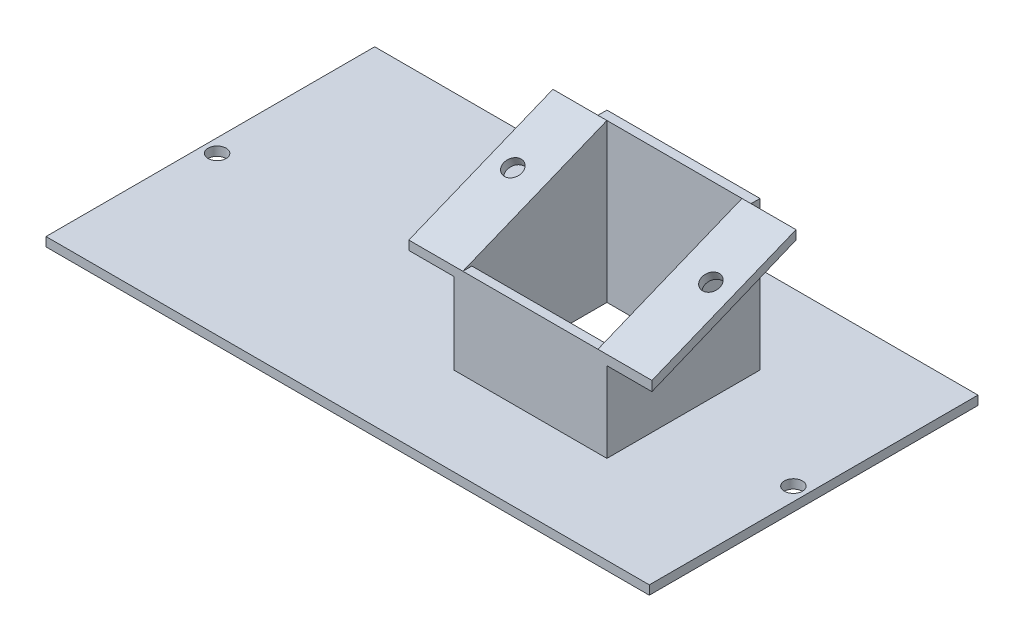
ISO-10303-21;
HEADER;
FILE_DESCRIPTION(('STEP AP214'),'2;1');
FILE_NAME('part.step','',(''),(''),'','','');
FILE_SCHEMA(('AUTOMOTIVE_DESIGN { 1 0 10303 214 1 1 1 1 }'));
ENDSEC;
DATA;
#1=APPLICATION_CONTEXT('core data for automotive mechanical design processes');
#2=APPLICATION_PROTOCOL_DEFINITION('international standard','automotive_design',2000,#1);
#3=PRODUCT_CONTEXT('',#1,'mechanical');
#4=PRODUCT('Part','Part','',(#3));
#5=PRODUCT_RELATED_PRODUCT_CATEGORY('part','',(#4));
#6=PRODUCT_DEFINITION_FORMATION('','',#4);
#7=PRODUCT_DEFINITION_CONTEXT('part definition',#1,'design');
#8=PRODUCT_DEFINITION('design','',#6,#7);
#9=PRODUCT_DEFINITION_SHAPE('','',#8);
#10=(LENGTH_UNIT() NAMED_UNIT(*) SI_UNIT(.MILLI.,.METRE.));
#11=(NAMED_UNIT(*) PLANE_ANGLE_UNIT() SI_UNIT($,.RADIAN.));
#12=(NAMED_UNIT(*) SI_UNIT($,.STERADIAN.) SOLID_ANGLE_UNIT());
#13=UNCERTAINTY_MEASURE_WITH_UNIT(LENGTH_MEASURE(1.E-05),#10,'distance_accuracy_value','');
#14=(GEOMETRIC_REPRESENTATION_CONTEXT(3) GLOBAL_UNCERTAINTY_ASSIGNED_CONTEXT((#13)) GLOBAL_UNIT_ASSIGNED_CONTEXT((#10,
#11,#12)) REPRESENTATION_CONTEXT('',''));
#15=CARTESIAN_POINT('',(0.,0.,0.));
#16=DIRECTION('',(0.,0.,1.));
#17=DIRECTION('',(1.,0.,0.));
#18=AXIS2_PLACEMENT_3D('',#15,#16,#17);
#19=CARTESIAN_POINT('',(28.7994604633108,22.,-22.5608347346221));
#20=DIRECTION('',(-1.,0.,0.));
#21=DIRECTION('',(0.,0.,1.));
#22=AXIS2_PLACEMENT_3D('',#19,#20,#21);
#23=PLANE('',#22);
#24=DIRECTION('',(0.,0.380378526899359,-0.92483089063562));
#25=VECTOR('',#24,1.);
#26=CARTESIAN_POINT('',(28.7994604633108,32.9978821570871,-20.5608347346221));
#27=LINE('',#26,#25);
#28=CARTESIAN_POINT('',(28.7994604633108,19.8364350384535,11.4391652653779));
#29=VERTEX_POINT('',#28);
#30=CARTESIAN_POINT('',(28.7994604633108,32.9978821570871,-20.5608347346221));
#31=VERTEX_POINT('',#30);
#32=EDGE_CURVE('E61',#29,#31,#27,.T.);
#33=ORIENTED_EDGE('',*,*,#32,.F.);
#34=DIRECTION('',(0.,-1.,0.));
#35=VECTOR('',#34,1.);
#36=CARTESIAN_POINT('',(28.7994604633108,22.,11.4391652653779));
#37=LINE('',#36,#35);
#38=CARTESIAN_POINT('',(28.7994604633108,2.,11.4391652653779));
#39=VERTEX_POINT('',#38);
#40=EDGE_CURVE('E194',#29,#39,#37,.T.);
#41=ORIENTED_EDGE('',*,*,#40,.T.);
#42=DIRECTION('',(0.,0.,-1.));
#43=VECTOR('',#42,1.);
#44=CARTESIAN_POINT('',(28.7994604633108,2.,-22.5608347346221));
#45=LINE('',#44,#43);
#46=CARTESIAN_POINT('',(28.7994604633108,2.,-22.5608347346221));
#47=VERTEX_POINT('',#46);
#48=EDGE_CURVE('E255',#39,#47,#45,.T.);
#49=ORIENTED_EDGE('',*,*,#48,.T.);
#50=DIRECTION('',(0.,-1.,0.));
#51=VECTOR('',#50,1.);
#52=CARTESIAN_POINT('',(28.7994604633108,22.,-22.5608347346221));
#53=LINE('',#52,#51);
#54=CARTESIAN_POINT('',(28.7994604633108,35.,-22.5608347346221));
#55=VERTEX_POINT('',#54);
#56=EDGE_CURVE('E274',#55,#47,#53,.T.);
#57=ORIENTED_EDGE('',*,*,#56,.F.);
#58=DIRECTION('',(0.,0.,-1.));
#59=VECTOR('',#58,1.);
#60=CARTESIAN_POINT('',(28.7994604633108,35.,-22.5608347346221));
#61=LINE('',#60,#59);
#62=CARTESIAN_POINT('',(28.7994604633108,35.,-20.5608347346221));
#63=VERTEX_POINT('',#62);
#64=EDGE_CURVE('E246',#63,#55,#61,.T.);
#65=ORIENTED_EDGE('',*,*,#64,.F.);
#66=DIRECTION('',(0.,1.,0.));
#67=VECTOR('',#66,1.);
#68=CARTESIAN_POINT('',(28.7994604633108,35.,-20.5608347346221));
#69=LINE('',#68,#67);
#70=EDGE_CURVE('E57',#31,#63,#69,.T.);
#71=ORIENTED_EDGE('',*,*,#70,.F.);
#72=EDGE_LOOP('',(#33,#41,#49,#57,#65,#71));
#73=FACE_BOUND('',#72,.T.);
#74=ADVANCED_FACE('F40',(#73),#23,.F.);
#75=CARTESIAN_POINT('',(-5.20053953668923,22.,-22.5608347346221));
#76=DIRECTION('',(1.,0.,0.));
#77=DIRECTION('',(0.,0.,-1.));
#78=AXIS2_PLACEMENT_3D('',#75,#76,#77);
#79=PLANE('',#78);
#80=DIRECTION('',(0.,-1.,0.));
#81=VECTOR('',#80,1.);
#82=CARTESIAN_POINT('',(-5.20053953668923,35.,-20.5608347346221));
#83=LINE('',#82,#81);
#84=CARTESIAN_POINT('',(-5.20053953668923,35.,-20.5608347346221));
#85=VERTEX_POINT('',#84);
#86=CARTESIAN_POINT('',(-5.20053953668923,32.9893160206082,-20.5608347346221));
#87=VERTEX_POINT('',#86);
#88=EDGE_CURVE('E195',#85,#87,#83,.T.);
#89=ORIENTED_EDGE('',*,*,#88,.F.);
#90=DIRECTION('',(0.,0.,1.));
#91=VECTOR('',#90,1.);
#92=CARTESIAN_POINT('',(-5.20053953668923,35.,-22.5608347346221));
#93=LINE('',#92,#91);
#94=CARTESIAN_POINT('',(-5.20053953668923,35.,-22.5608347346221));
#95=VERTEX_POINT('',#94);
#96=EDGE_CURVE('E239',#95,#85,#93,.T.);
#97=ORIENTED_EDGE('',*,*,#96,.F.);
#98=DIRECTION('',(0.,-1.,0.));
#99=VECTOR('',#98,1.);
#100=CARTESIAN_POINT('',(-5.20053953668923,22.,-22.5608347346221));
#101=LINE('',#100,#99);
#102=CARTESIAN_POINT('',(-5.20053953668923,2.,-22.5608347346221));
#103=VERTEX_POINT('',#102);
#104=EDGE_CURVE('E271',#95,#103,#101,.T.);
#105=ORIENTED_EDGE('',*,*,#104,.T.);
#106=DIRECTION('',(0.,0.,1.));
#107=VECTOR('',#106,1.);
#108=CARTESIAN_POINT('',(-5.20053953668923,2.,-22.5608347346221));
#109=LINE('',#108,#107);
#110=CARTESIAN_POINT('',(-5.20053953668922,2.,11.4391652653779));
#111=VERTEX_POINT('',#110);
#112=EDGE_CURVE('E263',#103,#111,#109,.T.);
#113=ORIENTED_EDGE('',*,*,#112,.T.);
#114=DIRECTION('',(0.,-1.,0.));
#115=VECTOR('',#114,1.);
#116=CARTESIAN_POINT('',(-5.20053953668922,22.,11.4391652653779));
#117=LINE('',#116,#115);
#118=CARTESIAN_POINT('',(-5.20053953668922,20.0015703241349,11.4391652653779));
#119=VERTEX_POINT('',#118);
#120=EDGE_CURVE('E269',#119,#111,#117,.T.);
#121=ORIENTED_EDGE('',*,*,#120,.F.);
#122=DIRECTION('',(0.,-0.376072457477557,0.926590258273198));
#123=VECTOR('',#122,1.);
#124=CARTESIAN_POINT('',(-5.20053953668922,20.0015703241349,11.4391652653779));
#125=LINE('',#124,#123);
#126=EDGE_CURVE('E198',#87,#119,#125,.T.);
#127=ORIENTED_EDGE('',*,*,#126,.F.);
#128=EDGE_LOOP('',(#89,#97,#105,#113,#121,#127));
#129=FACE_BOUND('',#128,.T.);
#130=ADVANCED_FACE('F372',(#129),#79,.F.);
#131=CARTESIAN_POINT('',(-3.20053953668922,2.,-20.5608347346221));
#132=DIRECTION('',(0.,0.,1.));
#133=DIRECTION('',(1.,0.,0.));
#134=AXIS2_PLACEMENT_3D('',#131,#132,#133);
#135=PLANE('',#134);
#136=DIRECTION('',(1.,0.,0.));
#137=VECTOR('',#136,1.);
#138=CARTESIAN_POINT('',(-5.20053953668923,35.,-20.5608347346221));
#139=LINE('',#138,#137);
#140=CARTESIAN_POINT('',(-3.20053953668923,35.,-20.5608347346221));
#141=VERTEX_POINT('',#140);
#142=CARTESIAN_POINT('',(26.7994604633108,35.,-20.5608347346221));
#143=VERTEX_POINT('',#142);
#144=EDGE_CURVE('E242',#141,#143,#139,.T.);
#145=ORIENTED_EDGE('',*,*,#144,.F.);
#146=DIRECTION('',(0.,-1.,0.));
#147=VECTOR('',#146,1.);
#148=CARTESIAN_POINT('',(-3.20053953668922,2.,-20.5608347346221));
#149=LINE('',#148,#147);
#150=CARTESIAN_POINT('',(-3.20053953668922,0.,-20.5608347346221));
#151=VERTEX_POINT('',#150);
#152=EDGE_CURVE('E300',#141,#151,#149,.T.);
#153=ORIENTED_EDGE('',*,*,#152,.T.);
#154=DIRECTION('',(-1.,0.,0.));
#155=VECTOR('',#154,1.);
#156=CARTESIAN_POINT('',(-3.20053953668922,0.,-20.5608347346221));
#157=LINE('',#156,#155);
#158=CARTESIAN_POINT('',(26.7994604633108,0.,-20.5608347346221));
#159=VERTEX_POINT('',#158);
#160=EDGE_CURVE('E297',#159,#151,#157,.T.);
#161=ORIENTED_EDGE('',*,*,#160,.F.);
#162=DIRECTION('',(0.,-1.,0.));
#163=VECTOR('',#162,1.);
#164=CARTESIAN_POINT('',(26.7994604633108,2.,-20.5608347346221));
#165=LINE('',#164,#163);
#166=EDGE_CURVE('E303',#143,#159,#165,.T.);
#167=ORIENTED_EDGE('',*,*,#166,.F.);
#168=EDGE_LOOP('',(#145,#153,#161,#167));
#169=FACE_BOUND('',#168,.T.);
#170=ADVANCED_FACE('F379',(#169),#135,.T.);
#171=CARTESIAN_POINT('',(0.,22.,0.));
#172=DIRECTION('',(0.,1.,0.));
#173=DIRECTION('',(0.,0.,1.));
#174=AXIS2_PLACEMENT_3D('',#171,#172,#173);
#175=PLANE('',#174);
#176=DIRECTION('',(1.,0.,0.));
#177=VECTOR('',#176,1.);
#178=CARTESIAN_POINT('',(-3.20053953668922,22.,9.43916526537794));
#179=LINE('',#178,#177);
#180=CARTESIAN_POINT('',(-3.20053953668923,22.,9.43916526537794));
#181=VERTEX_POINT('',#180);
#182=CARTESIAN_POINT('',(26.7994604633108,22.,9.43916526537794));
#183=VERTEX_POINT('',#182);
#184=EDGE_CURVE('E252',#181,#183,#179,.T.);
#185=ORIENTED_EDGE('',*,*,#184,.F.);
#186=DIRECTION('',(0.,0.,1.));
#187=VECTOR('',#186,1.);
#188=CARTESIAN_POINT('',(-3.20053953668923,22.,-20.5608347346221));
#189=LINE('',#188,#187);
#190=CARTESIAN_POINT('',(-3.20053953668922,22.,11.4391652653779));
#191=VERTEX_POINT('',#190);
#192=EDGE_CURVE('E228',#181,#191,#189,.T.);
#193=ORIENTED_EDGE('',*,*,#192,.T.);
#194=DIRECTION('',(1.,0.,0.));
#195=VECTOR('',#194,1.);
#196=CARTESIAN_POINT('',(-5.20053953668922,22.,11.4391652653779));
#197=LINE('',#196,#195);
#198=CARTESIAN_POINT('',(26.7994604633108,22.,11.4391652653779));
#199=VERTEX_POINT('',#198);
#200=EDGE_CURVE('E258',#191,#199,#197,.T.);
#201=ORIENTED_EDGE('',*,*,#200,.T.);
#202=DIRECTION('',(0.,0.,-1.));
#203=VECTOR('',#202,1.);
#204=CARTESIAN_POINT('',(26.7994604633108,22.,11.4391652653779));
#205=LINE('',#204,#203);
#206=EDGE_CURVE('E234',#199,#183,#205,.T.);
#207=ORIENTED_EDGE('',*,*,#206,.T.);
#208=EDGE_LOOP('',(#185,#193,#201,#207));
#209=FACE_BOUND('',#208,.T.);
#210=ADVANCED_FACE('F396',(#209),#175,.T.);
#211=CARTESIAN_POINT('',(0.,2.,0.));
#212=DIRECTION('',(0.,1.,0.));
#213=DIRECTION('',(0.,0.,1.));
#214=AXIS2_PLACEMENT_3D('',#211,#212,#213);
#215=PLANE('',#214);
#216=CARTESIAN_POINT('',(54.8288503417247,2.,-3.94952887890896));
#217=DIRECTION('',(0.,1.,0.));
#218=DIRECTION('',(0.,0.,1.));
#219=AXIS2_PLACEMENT_3D('',#216,#217,#218);
#220=CIRCLE('',#219,2.);
#221=CARTESIAN_POINT('',(54.8288503417247,2.,-1.94952887890896));
#222=VERTEX_POINT('',#221);
#223=EDGE_CURVE('E277',#222,#222,#220,.T.);
#224=ORIENTED_EDGE('',*,*,#223,.F.);
#225=EDGE_LOOP('',(#224));
#226=FACE_BOUND('',#225,.T.);
#227=DIRECTION('',(0.,0.,1.));
#228=VECTOR('',#227,1.);
#229=CARTESIAN_POINT('',(-76.1711496582753,2.,-41.9495288789089));
#230=LINE('',#229,#228);
#231=CARTESIAN_POINT('',(-76.1711496582753,2.,-41.9495288789089));
#232=VERTEX_POINT('',#231);
#233=CARTESIAN_POINT('',(-76.1711496582753,2.,31.050471121091));
#234=VERTEX_POINT('',#233);
#235=EDGE_CURVE('E311',#232,#234,#230,.T.);
#236=ORIENTED_EDGE('',*,*,#235,.T.);
#237=DIRECTION('',(1.,0.,0.));
#238=VECTOR('',#237,1.);
#239=CARTESIAN_POINT('',(-76.1711496582753,2.,31.050471121091));
#240=LINE('',#239,#238);
#241=CARTESIAN_POINT('',(57.8288503417247,2.,31.050471121091));
#242=VERTEX_POINT('',#241);
#243=EDGE_CURVE('E314',#234,#242,#240,.T.);
#244=ORIENTED_EDGE('',*,*,#243,.T.);
#245=DIRECTION('',(0.,0.,-1.));
#246=VECTOR('',#245,1.);
#247=CARTESIAN_POINT('',(57.8288503417247,2.,-41.9495288789089));
#248=LINE('',#247,#246);
#249=CARTESIAN_POINT('',(57.8288503417247,2.,-41.9495288789089));
#250=VERTEX_POINT('',#249);
#251=EDGE_CURVE('E317',#242,#250,#248,.T.);
#252=ORIENTED_EDGE('',*,*,#251,.T.);
#253=DIRECTION('',(-1.,0.,0.));
#254=VECTOR('',#253,1.);
#255=CARTESIAN_POINT('',(-76.1711496582753,2.,-41.9495288789089));
#256=LINE('',#255,#254);
#257=EDGE_CURVE('E319',#250,#232,#256,.T.);
#258=ORIENTED_EDGE('',*,*,#257,.T.);
#259=EDGE_LOOP('',(#236,#244,#252,#258));
#260=FACE_BOUND('',#259,.T.);
#261=CARTESIAN_POINT('',(-73.1711496582753,2.,-3.94952887890896));
#262=DIRECTION('',(0.,1.,0.));
#263=DIRECTION('',(0.,0.,1.));
#264=AXIS2_PLACEMENT_3D('',#261,#262,#263);
#265=CIRCLE('',#264,2.);
#266=CARTESIAN_POINT('',(-73.1711496582753,2.,-1.94952887890896));
#267=VERTEX_POINT('',#266);
#268=EDGE_CURVE('E283',#267,#267,#265,.T.);
#269=ORIENTED_EDGE('',*,*,#268,.F.);
#270=EDGE_LOOP('',(#269));
#271=FACE_BOUND('',#270,.T.);
#272=DIRECTION('',(-1.,0.,0.));
#273=VECTOR('',#272,1.);
#274=CARTESIAN_POINT('',(-5.20053953668923,2.,-22.5608347346221));
#275=LINE('',#274,#273);
#276=EDGE_CURVE('E261',#47,#103,#275,.T.);
#277=ORIENTED_EDGE('',*,*,#276,.F.);
#278=ORIENTED_EDGE('',*,*,#48,.F.);
#279=DIRECTION('',(1.,0.,0.));
#280=VECTOR('',#279,1.);
#281=CARTESIAN_POINT('',(-5.20053953668922,2.,11.4391652653779));
#282=LINE('',#281,#280);
#283=EDGE_CURVE('E266',#111,#39,#282,.T.);
#284=ORIENTED_EDGE('',*,*,#283,.F.);
#285=ORIENTED_EDGE('',*,*,#112,.F.);
#286=EDGE_LOOP('',(#277,#278,#284,#285));
#287=FACE_BOUND('',#286,.T.);
#288=ADVANCED_FACE('F410',(#226,#260,#271,#287),#215,.T.);
#289=CARTESIAN_POINT('',(0.,0.,0.));
#290=DIRECTION('',(0.,1.,0.));
#291=DIRECTION('',(0.,0.,1.));
#292=AXIS2_PLACEMENT_3D('',#289,#290,#291);
#293=PLANE('',#292);
#294=DIRECTION('',(0.,0.,1.));
#295=VECTOR('',#294,1.);
#296=CARTESIAN_POINT('',(-76.1711496582753,0.,-41.9495288789089));
#297=LINE('',#296,#295);
#298=CARTESIAN_POINT('',(-76.1711496582753,0.,-41.9495288789089));
#299=VERTEX_POINT('',#298);
#300=CARTESIAN_POINT('',(-76.1711496582753,0.,31.050471121091));
#301=VERTEX_POINT('',#300);
#302=EDGE_CURVE('E310',#299,#301,#297,.T.);
#303=ORIENTED_EDGE('',*,*,#302,.F.);
#304=DIRECTION('',(-1.,0.,0.));
#305=VECTOR('',#304,1.);
#306=CARTESIAN_POINT('',(-76.1711496582753,0.,-41.9495288789089));
#307=LINE('',#306,#305);
#308=CARTESIAN_POINT('',(57.8288503417247,0.,-41.9495288789089));
#309=VERTEX_POINT('',#308);
#310=EDGE_CURVE('E315',#309,#299,#307,.T.);
#311=ORIENTED_EDGE('',*,*,#310,.F.);
#312=DIRECTION('',(0.,0.,-1.));
#313=VECTOR('',#312,1.);
#314=CARTESIAN_POINT('',(57.8288503417247,0.,-41.9495288789089));
#315=LINE('',#314,#313);
#316=CARTESIAN_POINT('',(57.8288503417247,0.,31.050471121091));
#317=VERTEX_POINT('',#316);
#318=EDGE_CURVE('E326',#317,#309,#315,.T.);
#319=ORIENTED_EDGE('',*,*,#318,.F.);
#320=DIRECTION('',(1.,0.,0.));
#321=VECTOR('',#320,1.);
#322=CARTESIAN_POINT('',(-76.1711496582753,0.,31.050471121091));
#323=LINE('',#322,#321);
#324=EDGE_CURVE('E324',#301,#317,#323,.T.);
#325=ORIENTED_EDGE('',*,*,#324,.F.);
#326=EDGE_LOOP('',(#303,#311,#319,#325));
#327=FACE_BOUND('',#326,.T.);
#328=DIRECTION('',(0.,0.,1.));
#329=VECTOR('',#328,1.);
#330=CARTESIAN_POINT('',(-3.20053953668922,0.,-20.5608347346221));
#331=LINE('',#330,#329);
#332=CARTESIAN_POINT('',(-3.20053953668922,0.,9.43916526537794));
#333=VERTEX_POINT('',#332);
#334=EDGE_CURVE('E286',#151,#333,#331,.T.);
#335=ORIENTED_EDGE('',*,*,#334,.T.);
#336=DIRECTION('',(1.,0.,0.));
#337=VECTOR('',#336,1.);
#338=CARTESIAN_POINT('',(-3.20053953668922,0.,9.43916526537794));
#339=LINE('',#338,#337);
#340=CARTESIAN_POINT('',(26.7994604633108,0.,9.43916526537794));
#341=VERTEX_POINT('',#340);
#342=EDGE_CURVE('E291',#333,#341,#339,.T.);
#343=ORIENTED_EDGE('',*,*,#342,.T.);
#344=DIRECTION('',(0.,0.,-1.));
#345=VECTOR('',#344,1.);
#346=CARTESIAN_POINT('',(26.7994604633108,0.,-20.5608347346221));
#347=LINE('',#346,#345);
#348=EDGE_CURVE('E294',#341,#159,#347,.T.);
#349=ORIENTED_EDGE('',*,*,#348,.T.);
#350=ORIENTED_EDGE('',*,*,#160,.T.);
#351=EDGE_LOOP('',(#335,#343,#349,#350));
#352=FACE_BOUND('',#351,.T.);
#353=CARTESIAN_POINT('',(-73.1711496582753,0.,-3.94952887890896));
#354=DIRECTION('',(0.,1.,0.));
#355=DIRECTION('',(0.,0.,1.));
#356=AXIS2_PLACEMENT_3D('',#353,#354,#355);
#357=CIRCLE('',#356,2.);
#358=CARTESIAN_POINT('',(-73.1711496582753,0.,-1.94952887890896));
#359=VERTEX_POINT('',#358);
#360=EDGE_CURVE('E280',#359,#359,#357,.T.);
#361=ORIENTED_EDGE('',*,*,#360,.T.);
#362=EDGE_LOOP('',(#361));
#363=FACE_BOUND('',#362,.T.);
#364=CARTESIAN_POINT('',(54.8288503417247,0.,-3.94952887890896));
#365=DIRECTION('',(0.,1.,0.));
#366=DIRECTION('',(0.,0.,1.));
#367=AXIS2_PLACEMENT_3D('',#364,#365,#366);
#368=CIRCLE('',#367,2.);
#369=CARTESIAN_POINT('',(54.8288503417247,0.,-1.94952887890896));
#370=VERTEX_POINT('',#369);
#371=EDGE_CURVE('E276',#370,#370,#368,.T.);
#372=ORIENTED_EDGE('',*,*,#371,.T.);
#373=EDGE_LOOP('',(#372));
#374=FACE_BOUND('',#373,.T.);
#375=ADVANCED_FACE('F413',(#327,#352,#363,#374),#293,.F.);
#376=CARTESIAN_POINT('',(-76.1711496582753,2.,-41.9495288789089));
#377=DIRECTION('',(1.,0.,0.));
#378=DIRECTION('',(0.,0.,-1.));
#379=AXIS2_PLACEMENT_3D('',#376,#377,#378);
#380=PLANE('',#379);
#381=ORIENTED_EDGE('',*,*,#302,.T.);
#382=DIRECTION('',(0.,-1.,0.));
#383=VECTOR('',#382,1.);
#384=CARTESIAN_POINT('',(-76.1711496582753,2.,31.050471121091));
#385=LINE('',#384,#383);
#386=EDGE_CURVE('E11',#234,#301,#385,.T.);
#387=ORIENTED_EDGE('',*,*,#386,.F.);
#388=ORIENTED_EDGE('',*,*,#235,.F.);
#389=DIRECTION('',(0.,-1.,0.));
#390=VECTOR('',#389,1.);
#391=CARTESIAN_POINT('',(-76.1711496582753,2.,-41.9495288789089));
#392=LINE('',#391,#390);
#393=EDGE_CURVE('E321',#232,#299,#392,.T.);
#394=ORIENTED_EDGE('',*,*,#393,.T.);
#395=EDGE_LOOP('',(#381,#387,#388,#394));
#396=FACE_BOUND('',#395,.T.);
#397=ADVANCED_FACE('F42',(#396),#380,.F.);
#398=CARTESIAN_POINT('',(-76.1711496582753,2.,31.050471121091));
#399=DIRECTION('',(0.,0.,-1.));
#400=DIRECTION('',(-1.,0.,0.));
#401=AXIS2_PLACEMENT_3D('',#398,#399,#400);
#402=PLANE('',#401);
#403=ORIENTED_EDGE('',*,*,#324,.T.);
#404=DIRECTION('',(0.,-1.,0.));
#405=VECTOR('',#404,1.);
#406=CARTESIAN_POINT('',(57.8288503417247,2.,31.050471121091));
#407=LINE('',#406,#405);
#408=EDGE_CURVE('E49',#242,#317,#407,.T.);
#409=ORIENTED_EDGE('',*,*,#408,.F.);
#410=ORIENTED_EDGE('',*,*,#243,.F.);
#411=ORIENTED_EDGE('',*,*,#386,.T.);
#412=EDGE_LOOP('',(#403,#409,#410,#411));
#413=FACE_BOUND('',#412,.T.);
#414=ADVANCED_FACE('F423',(#413),#402,.F.);
#415=CARTESIAN_POINT('',(57.8288503417247,2.,-41.9495288789089));
#416=DIRECTION('',(-1.,0.,0.));
#417=DIRECTION('',(0.,0.,1.));
#418=AXIS2_PLACEMENT_3D('',#415,#416,#417);
#419=PLANE('',#418);
#420=ORIENTED_EDGE('',*,*,#318,.T.);
#421=DIRECTION('',(0.,-1.,0.));
#422=VECTOR('',#421,1.);
#423=CARTESIAN_POINT('',(57.8288503417247,2.,-41.9495288789089));
#424=LINE('',#423,#422);
#425=EDGE_CURVE('E331',#250,#309,#424,.T.);
#426=ORIENTED_EDGE('',*,*,#425,.F.);
#427=ORIENTED_EDGE('',*,*,#251,.F.);
#428=ORIENTED_EDGE('',*,*,#408,.T.);
#429=EDGE_LOOP('',(#420,#426,#427,#428));
#430=FACE_BOUND('',#429,.T.);
#431=ADVANCED_FACE('F420',(#430),#419,.F.);
#432=CARTESIAN_POINT('',(-76.1711496582753,2.,-41.9495288789089));
#433=DIRECTION('',(0.,0.,1.));
#434=DIRECTION('',(1.,0.,0.));
#435=AXIS2_PLACEMENT_3D('',#432,#433,#434);
#436=PLANE('',#435);
#437=ORIENTED_EDGE('',*,*,#310,.T.);
#438=ORIENTED_EDGE('',*,*,#393,.F.);
#439=ORIENTED_EDGE('',*,*,#257,.F.);
#440=ORIENTED_EDGE('',*,*,#425,.T.);
#441=EDGE_LOOP('',(#437,#438,#439,#440));
#442=FACE_BOUND('',#441,.T.);
#443=ADVANCED_FACE('F408',(#442),#436,.F.);
#444=CARTESIAN_POINT('',(-3.20053953668922,2.,-20.5608347346221));
#445=DIRECTION('',(1.,0.,0.));
#446=DIRECTION('',(0.,0.,-1.));
#447=AXIS2_PLACEMENT_3D('',#444,#445,#446);
#448=PLANE('',#447);
#449=ORIENTED_EDGE('',*,*,#334,.F.);
#450=ORIENTED_EDGE('',*,*,#152,.F.);
#451=DIRECTION('',(0.,0.376377046955938,-0.926466577122309));
#452=VECTOR('',#451,1.);
#453=CARTESIAN_POINT('',(-3.20053953668922,22.,11.4391652653779));
#454=LINE('',#453,#452);
#455=EDGE_CURVE('E225',#191,#141,#454,.T.);
#456=ORIENTED_EDGE('',*,*,#455,.F.);
#457=ORIENTED_EDGE('',*,*,#192,.F.);
#458=DIRECTION('',(0.,-1.,0.));
#459=VECTOR('',#458,1.);
#460=CARTESIAN_POINT('',(-3.20053953668922,2.,9.43916526537794));
#461=LINE('',#460,#459);
#462=EDGE_CURVE('E307',#181,#333,#461,.T.);
#463=ORIENTED_EDGE('',*,*,#462,.T.);
#464=EDGE_LOOP('',(#449,#450,#456,#457,#463));
#465=FACE_BOUND('',#464,.T.);
#466=ADVANCED_FACE('F404',(#465),#448,.T.);
#467=CARTESIAN_POINT('',(-3.20053953668922,2.,9.43916526537794));
#468=DIRECTION('',(0.,0.,-1.));
#469=DIRECTION('',(-1.,0.,0.));
#470=AXIS2_PLACEMENT_3D('',#467,#468,#469);
#471=PLANE('',#470);
#472=ORIENTED_EDGE('',*,*,#342,.F.);
#473=ORIENTED_EDGE('',*,*,#462,.F.);
#474=ORIENTED_EDGE('',*,*,#184,.T.);
#475=DIRECTION('',(0.,-1.,0.));
#476=VECTOR('',#475,1.);
#477=CARTESIAN_POINT('',(26.7994604633108,2.,9.43916526537794));
#478=LINE('',#477,#476);
#479=EDGE_CURVE('E305',#183,#341,#478,.T.);
#480=ORIENTED_EDGE('',*,*,#479,.T.);
#481=EDGE_LOOP('',(#472,#473,#474,#480));
#482=FACE_BOUND('',#481,.T.);
#483=ADVANCED_FACE('F400',(#482),#471,.T.);
#484=CARTESIAN_POINT('',(26.7994604633108,2.,-20.5608347346221));
#485=DIRECTION('',(-1.,0.,0.));
#486=DIRECTION('',(0.,0.,1.));
#487=AXIS2_PLACEMENT_3D('',#484,#485,#486);
#488=PLANE('',#487);
#489=ORIENTED_EDGE('',*,*,#348,.F.);
#490=ORIENTED_EDGE('',*,*,#479,.F.);
#491=ORIENTED_EDGE('',*,*,#206,.F.);
#492=DIRECTION('',(0.,-0.376377046955938,0.926466577122309));
#493=VECTOR('',#492,1.);
#494=CARTESIAN_POINT('',(26.7994604633108,35.,-20.5608347346221));
#495=LINE('',#494,#493);
#496=EDGE_CURVE('E231',#143,#199,#495,.T.);
#497=ORIENTED_EDGE('',*,*,#496,.F.);
#498=ORIENTED_EDGE('',*,*,#166,.T.);
#499=EDGE_LOOP('',(#489,#490,#491,#497,#498));
#500=FACE_BOUND('',#499,.T.);
#501=ADVANCED_FACE('F392',(#500),#488,.T.);
#502=CARTESIAN_POINT('',(-73.1711496582753,2.,-3.94952887890896));
#503=DIRECTION('',(0.,-1.,0.));
#504=DIRECTION('',(0.,0.,-1.));
#505=AXIS2_PLACEMENT_3D('',#502,#503,#504);
#506=CYLINDRICAL_SURFACE('',#505,2.);
#507=ORIENTED_EDGE('',*,*,#268,.T.);
#508=EDGE_LOOP('',(#507));
#509=FACE_BOUND('',#508,.T.);
#510=ORIENTED_EDGE('',*,*,#360,.F.);
#511=EDGE_LOOP('',(#510));
#512=FACE_BOUND('',#511,.T.);
#513=ADVANCED_FACE('F388',(#509,#512),#506,.F.);
#514=CARTESIAN_POINT('',(54.8288503417247,2.,-3.94952887890896));
#515=DIRECTION('',(0.,-1.,0.));
#516=DIRECTION('',(0.,0.,-1.));
#517=AXIS2_PLACEMENT_3D('',#514,#515,#516);
#518=CYLINDRICAL_SURFACE('',#517,2.);
#519=ORIENTED_EDGE('',*,*,#223,.T.);
#520=EDGE_LOOP('',(#519));
#521=FACE_BOUND('',#520,.T.);
#522=ORIENTED_EDGE('',*,*,#371,.F.);
#523=EDGE_LOOP('',(#522));
#524=FACE_BOUND('',#523,.T.);
#525=ADVANCED_FACE('F385',(#521,#524),#518,.F.);
#526=CARTESIAN_POINT('',(-5.20053953668923,22.,-22.5608347346221));
#527=DIRECTION('',(0.,0.,1.));
#528=DIRECTION('',(1.,0.,0.));
#529=AXIS2_PLACEMENT_3D('',#526,#527,#528);
#530=PLANE('',#529);
#531=ORIENTED_EDGE('',*,*,#276,.T.);
#532=ORIENTED_EDGE('',*,*,#104,.F.);
#533=DIRECTION('',(-1.,0.,0.));
#534=VECTOR('',#533,1.);
#535=CARTESIAN_POINT('',(-5.20053953668923,35.,-22.5608347346221));
#536=LINE('',#535,#534);
#537=EDGE_CURVE('E249',#55,#95,#536,.T.);
#538=ORIENTED_EDGE('',*,*,#537,.F.);
#539=ORIENTED_EDGE('',*,*,#56,.T.);
#540=EDGE_LOOP('',(#531,#532,#538,#539));
#541=FACE_BOUND('',#540,.T.);
#542=ADVANCED_FACE('F384',(#541),#530,.F.);
#543=CARTESIAN_POINT('',(-5.20053953668922,22.,11.4391652653779));
#544=DIRECTION('',(0.,0.,-1.));
#545=DIRECTION('',(-1.,0.,0.));
#546=AXIS2_PLACEMENT_3D('',#543,#544,#545);
#547=PLANE('',#546);
#548=ORIENTED_EDGE('',*,*,#283,.T.);
#549=ORIENTED_EDGE('',*,*,#40,.F.);
#550=DIRECTION('',(-1.,0.,0.));
#551=VECTOR('',#550,1.);
#552=CARTESIAN_POINT('',(38.7994604633108,19.8364350384535,11.4391652653779));
#553=LINE('',#552,#551);
#554=CARTESIAN_POINT('',(38.7994604633108,19.8364350384535,11.4391652653779));
#555=VERTEX_POINT('',#554);
#556=EDGE_CURVE('E176',#555,#29,#553,.T.);
#557=ORIENTED_EDGE('',*,*,#556,.F.);
#558=DIRECTION('',(0.,-1.,0.));
#559=VECTOR('',#558,1.);
#560=CARTESIAN_POINT('',(38.7994604633108,19.8364350384535,11.4391652653779));
#561=LINE('',#560,#559);
#562=CARTESIAN_POINT('',(38.7994604633108,22.,11.4391652653779));
#563=VERTEX_POINT('',#562);
#564=EDGE_CURVE('E182',#563,#555,#561,.T.);
#565=ORIENTED_EDGE('',*,*,#564,.F.);
#566=DIRECTION('',(1.,0.,0.));
#567=VECTOR('',#566,1.);
#568=CARTESIAN_POINT('',(26.7994604633108,22.,11.4391652653779));
#569=LINE('',#568,#567);
#570=EDGE_CURVE('E236',#199,#563,#569,.T.);
#571=ORIENTED_EDGE('',*,*,#570,.F.);
#572=ORIENTED_EDGE('',*,*,#200,.F.);
#573=CARTESIAN_POINT('',(-15.2005395366892,22.,11.4391652653779));
#574=VERTEX_POINT('',#573);
#575=EDGE_CURVE('E256',#574,#191,#197,.T.);
#576=ORIENTED_EDGE('',*,*,#575,.F.);
#577=DIRECTION('',(0.,1.,0.));
#578=VECTOR('',#577,1.);
#579=CARTESIAN_POINT('',(-15.2005395366892,22.,11.4391652653779));
#580=LINE('',#579,#578);
#581=CARTESIAN_POINT('',(-15.2005395366892,20.0015703241349,11.4391652653779));
#582=VERTEX_POINT('',#581);
#583=EDGE_CURVE('E211',#582,#574,#580,.T.);
#584=ORIENTED_EDGE('',*,*,#583,.F.);
#585=DIRECTION('',(1.,0.,0.));
#586=VECTOR('',#585,1.);
#587=CARTESIAN_POINT('',(-15.2005395366892,20.0015703241349,11.4391652653779));
#588=LINE('',#587,#586);
#589=EDGE_CURVE('E213',#582,#119,#588,.T.);
#590=ORIENTED_EDGE('',*,*,#589,.T.);
#591=ORIENTED_EDGE('',*,*,#120,.T.);
#592=EDGE_LOOP('',(#548,#549,#557,#565,#571,#572,#576,#584,#590,#591));
#593=FACE_BOUND('',#592,.T.);
#594=ADVANCED_FACE('F193',(#593),#547,.F.);
#595=CARTESIAN_POINT('',(0.,35.,0.));
#596=DIRECTION('',(0.,1.,0.));
#597=DIRECTION('',(0.,0.,1.));
#598=AXIS2_PLACEMENT_3D('',#595,#596,#597);
#599=PLANE('',#598);
#600=ORIENTED_EDGE('',*,*,#96,.T.);
#601=EDGE_CURVE('E243',#85,#141,#139,.T.);
#602=ORIENTED_EDGE('',*,*,#601,.T.);
#603=ORIENTED_EDGE('',*,*,#144,.T.);
#604=DIRECTION('',(1.,0.,0.));
#605=VECTOR('',#604,1.);
#606=CARTESIAN_POINT('',(26.7994604633108,35.,-20.5608347346221));
#607=LINE('',#606,#605);
#608=EDGE_CURVE('E237',#143,#63,#607,.T.);
#609=ORIENTED_EDGE('',*,*,#608,.T.);
#610=ORIENTED_EDGE('',*,*,#64,.T.);
#611=ORIENTED_EDGE('',*,*,#537,.T.);
#612=EDGE_LOOP('',(#600,#602,#603,#609,#610,#611));
#613=FACE_BOUND('',#612,.T.);
#614=ADVANCED_FACE('F456',(#613),#599,.T.);
#615=CARTESIAN_POINT('',(26.7994604633108,35.,-20.5608347346221));
#616=DIRECTION('',(0.,0.926466577122309,0.376377046955938));
#617=DIRECTION('',(0.,-0.376377046955938,0.926466577122309));
#618=AXIS2_PLACEMENT_3D('',#615,#616,#617);
#619=PLANE('',#618);
#620=CARTESIAN_POINT('',(33.7994604633108,29.3543442956609,-6.66383607778742));
#621=DIRECTION('',(0.,0.926466577122309,0.376377046955938));
#622=DIRECTION('',(0.,-0.376377046955938,0.926466577122309));
#623=AXIS2_PLACEMENT_3D('',#620,#621,#622);
#624=CIRCLE('',#623,2.);
#625=CARTESIAN_POINT('',(33.7994604633108,28.6015902017491,-4.8109029235428));
#626=VERTEX_POINT('',#625);
#627=EDGE_CURVE('E342',#626,#626,#624,.T.);
#628=ORIENTED_EDGE('',*,*,#627,.F.);
#629=EDGE_LOOP('',(#628));
#630=FACE_BOUND('',#629,.T.);
#631=ORIENTED_EDGE('',*,*,#570,.T.);
#632=DIRECTION('',(0.,-0.376377046955938,0.926466577122309));
#633=VECTOR('',#632,1.);
#634=CARTESIAN_POINT('',(38.7994604633108,22.,11.4391652653779));
#635=LINE('',#634,#633);
#636=CARTESIAN_POINT('',(38.7994604633108,35.,-20.5608347346221));
#637=VERTEX_POINT('',#636);
#638=EDGE_CURVE('E188',#637,#563,#635,.T.);
#639=ORIENTED_EDGE('',*,*,#638,.F.);
#640=DIRECTION('',(-1.,0.,0.));
#641=VECTOR('',#640,1.);
#642=CARTESIAN_POINT('',(38.7994604633108,35.,-20.5608347346221));
#643=LINE('',#642,#641);
#644=EDGE_CURVE('E200',#637,#63,#643,.T.);
#645=ORIENTED_EDGE('',*,*,#644,.T.);
#646=ORIENTED_EDGE('',*,*,#608,.F.);
#647=ORIENTED_EDGE('',*,*,#496,.T.);
#648=EDGE_LOOP('',(#631,#639,#645,#646,#647));
#649=FACE_BOUND('',#648,.T.);
#650=ADVANCED_FACE('F356',(#630,#649),#619,.T.);
#651=CARTESIAN_POINT('',(-3.20053953668922,22.,11.4391652653779));
#652=DIRECTION('',(0.,0.926466577122309,0.376377046955938));
#653=DIRECTION('',(0.,-0.376377046955938,0.926466577122309));
#654=AXIS2_PLACEMENT_3D('',#651,#652,#653);
#655=PLANE('',#654);
#656=CARTESIAN_POINT('',(-10.2005395366892,29.3543442956609,-6.66383607778742));
#657=DIRECTION('',(0.,0.926466577122309,0.376377046955938));
#658=DIRECTION('',(0.,-0.376377046955938,0.926466577122309));
#659=AXIS2_PLACEMENT_3D('',#656,#657,#658);
#660=CIRCLE('',#659,2.);
#661=CARTESIAN_POINT('',(-10.2005395366892,28.6015902017491,-4.8109029235428));
#662=VERTEX_POINT('',#661);
#663=EDGE_CURVE('E337',#662,#662,#660,.T.);
#664=ORIENTED_EDGE('',*,*,#663,.F.);
#665=EDGE_LOOP('',(#664));
#666=FACE_BOUND('',#665,.T.);
#667=ORIENTED_EDGE('',*,*,#601,.F.);
#668=DIRECTION('',(1.,0.,0.));
#669=VECTOR('',#668,1.);
#670=CARTESIAN_POINT('',(-15.2005395366892,35.,-20.5608347346221));
#671=LINE('',#670,#669);
#672=CARTESIAN_POINT('',(-15.2005395366892,35.,-20.5608347346221));
#673=VERTEX_POINT('',#672);
#674=EDGE_CURVE('E222',#673,#85,#671,.T.);
#675=ORIENTED_EDGE('',*,*,#674,.F.);
#676=DIRECTION('',(0.,0.376377046955938,-0.926466577122309));
#677=VECTOR('',#676,1.);
#678=CARTESIAN_POINT('',(-15.2005395366892,35.,-20.5608347346221));
#679=LINE('',#678,#677);
#680=EDGE_CURVE('E204',#574,#673,#679,.T.);
#681=ORIENTED_EDGE('',*,*,#680,.F.);
#682=ORIENTED_EDGE('',*,*,#575,.T.);
#683=ORIENTED_EDGE('',*,*,#455,.T.);
#684=EDGE_LOOP('',(#667,#675,#681,#682,#683));
#685=FACE_BOUND('',#684,.T.);
#686=ADVANCED_FACE('F459',(#666,#685),#655,.T.);
#687=CARTESIAN_POINT('',(-15.2005395366892,35.,-20.5608347346221));
#688=DIRECTION('',(0.,0.,1.));
#689=DIRECTION('',(1.,0.,0.));
#690=AXIS2_PLACEMENT_3D('',#687,#688,#689);
#691=PLANE('',#690);
#692=ORIENTED_EDGE('',*,*,#88,.T.);
#693=DIRECTION('',(1.,0.,0.));
#694=VECTOR('',#693,1.);
#695=CARTESIAN_POINT('',(-15.2005395366892,32.9893160206082,-20.5608347346221));
#696=LINE('',#695,#694);
#697=CARTESIAN_POINT('',(-15.2005395366892,32.9893160206082,-20.5608347346221));
#698=VERTEX_POINT('',#697);
#699=EDGE_CURVE('E219',#698,#87,#696,.T.);
#700=ORIENTED_EDGE('',*,*,#699,.F.);
#701=DIRECTION('',(0.,-1.,0.));
#702=VECTOR('',#701,1.);
#703=CARTESIAN_POINT('',(-15.2005395366892,35.,-20.5608347346221));
#704=LINE('',#703,#702);
#705=EDGE_CURVE('E207',#673,#698,#704,.T.);
#706=ORIENTED_EDGE('',*,*,#705,.F.);
#707=ORIENTED_EDGE('',*,*,#674,.T.);
#708=EDGE_LOOP('',(#692,#700,#706,#707));
#709=FACE_BOUND('',#708,.T.);
#710=ADVANCED_FACE('F472',(#709),#691,.F.);
#711=CARTESIAN_POINT('',(-15.2005395366892,20.0015703241349,11.4391652653779));
#712=DIRECTION('',(0.,0.926590258273198,0.376072457477557));
#713=DIRECTION('',(0.,-0.376072457477557,0.926590258273198));
#714=AXIS2_PLACEMENT_3D('',#711,#712,#713);
#715=PLANE('',#714);
#716=CARTESIAN_POINT('',(-10.2005395366892,27.6328312152771,-7.36320076669336));
#717=DIRECTION('',(0.,0.926590258273198,0.376072457477557));
#718=DIRECTION('',(0.,-0.376072457477557,0.926590258273198));
#719=AXIS2_PLACEMENT_3D('',#716,#717,#718);
#720=ELLIPSE('',#719,2.00000010807178,2.);
#721=CARTESIAN_POINT('',(-10.2005395366892,26.8806862596792,-5.5100201500087));
#722=VERTEX_POINT('',#721);
#723=EDGE_CURVE('E44',#722,#722,#720,.T.);
#724=ORIENTED_EDGE('',*,*,#723,.T.);
#725=EDGE_LOOP('',(#724));
#726=FACE_BOUND('',#725,.T.);
#727=ORIENTED_EDGE('',*,*,#126,.T.);
#728=ORIENTED_EDGE('',*,*,#589,.F.);
#729=DIRECTION('',(0.,-0.376072457477557,0.926590258273198));
#730=VECTOR('',#729,1.);
#731=CARTESIAN_POINT('',(-15.2005395366892,20.0015703241349,11.4391652653779));
#732=LINE('',#731,#730);
#733=EDGE_CURVE('E209',#698,#582,#732,.T.);
#734=ORIENTED_EDGE('',*,*,#733,.F.);
#735=ORIENTED_EDGE('',*,*,#699,.T.);
#736=EDGE_LOOP('',(#727,#728,#734,#735));
#737=FACE_BOUND('',#736,.T.);
#738=ADVANCED_FACE('F468',(#726,#737),#715,.F.);
#739=CARTESIAN_POINT('',(-15.2005395366892,0.,0.));
#740=DIRECTION('',(1.,0.,0.));
#741=DIRECTION('',(0.,0.,-1.));
#742=AXIS2_PLACEMENT_3D('',#739,#740,#741);
#743=PLANE('',#742);
#744=ORIENTED_EDGE('',*,*,#680,.T.);
#745=ORIENTED_EDGE('',*,*,#705,.T.);
#746=ORIENTED_EDGE('',*,*,#733,.T.);
#747=ORIENTED_EDGE('',*,*,#583,.T.);
#748=EDGE_LOOP('',(#744,#745,#746,#747));
#749=FACE_BOUND('',#748,.T.);
#750=ADVANCED_FACE('F369',(#749),#743,.F.);
#751=CARTESIAN_POINT('',(38.7994604633108,32.9978821570871,-20.5608347346221));
#752=DIRECTION('',(0.,0.92483089063562,0.380378526899359));
#753=DIRECTION('',(0.,-0.380378526899359,0.92483089063562));
#754=AXIS2_PLACEMENT_3D('',#751,#752,#753);
#755=PLANE('',#754);
#756=CARTESIAN_POINT('',(33.7994604633108,27.5787883153696,-7.38515569478077));
#757=DIRECTION('',(0.,0.92483089063562,0.380378526899359));
#758=DIRECTION('',(0.,0.380378526899359,-0.92483089063562));
#759=AXIS2_PLACEMENT_3D('',#756,#757,#758);
#760=ELLIPSE('',#759,2.00001868748663,2.);
#761=CARTESIAN_POINT('',(33.7994604633108,28.339552477487,-9.23483475881692));
#762=VERTEX_POINT('',#761);
#763=EDGE_CURVE('E335',#762,#762,#760,.T.);
#764=ORIENTED_EDGE('',*,*,#763,.T.);
#765=EDGE_LOOP('',(#764));
#766=FACE_BOUND('',#765,.T.);
#767=ORIENTED_EDGE('',*,*,#32,.T.);
#768=DIRECTION('',(-1.,0.,0.));
#769=VECTOR('',#768,1.);
#770=CARTESIAN_POINT('',(38.7994604633108,32.9978821570871,-20.5608347346221));
#771=LINE('',#770,#769);
#772=CARTESIAN_POINT('',(38.7994604633108,32.9978821570871,-20.5608347346221));
#773=VERTEX_POINT('',#772);
#774=EDGE_CURVE('E178',#773,#31,#771,.T.);
#775=ORIENTED_EDGE('',*,*,#774,.F.);
#776=DIRECTION('',(0.,0.380378526899359,-0.92483089063562));
#777=VECTOR('',#776,1.);
#778=CARTESIAN_POINT('',(38.7994604633108,32.9978821570871,-20.5608347346221));
#779=LINE('',#778,#777);
#780=EDGE_CURVE('E172',#555,#773,#779,.T.);
#781=ORIENTED_EDGE('',*,*,#780,.F.);
#782=ORIENTED_EDGE('',*,*,#556,.T.);
#783=EDGE_LOOP('',(#767,#775,#781,#782));
#784=FACE_BOUND('',#783,.T.);
#785=ADVANCED_FACE('F174',(#766,#784),#755,.F.);
#786=CARTESIAN_POINT('',(38.7994604633108,35.,-20.5608347346221));
#787=DIRECTION('',(0.,0.,1.));
#788=DIRECTION('',(1.,0.,0.));
#789=AXIS2_PLACEMENT_3D('',#786,#787,#788);
#790=PLANE('',#789);
#791=ORIENTED_EDGE('',*,*,#70,.T.);
#792=ORIENTED_EDGE('',*,*,#644,.F.);
#793=DIRECTION('',(0.,1.,0.));
#794=VECTOR('',#793,1.);
#795=CARTESIAN_POINT('',(38.7994604633108,35.,-20.5608347346221));
#796=LINE('',#795,#794);
#797=EDGE_CURVE('E181',#773,#637,#796,.T.);
#798=ORIENTED_EDGE('',*,*,#797,.F.);
#799=ORIENTED_EDGE('',*,*,#774,.T.);
#800=EDGE_LOOP('',(#791,#792,#798,#799));
#801=FACE_BOUND('',#800,.T.);
#802=ADVANCED_FACE('F359',(#801),#790,.F.);
#803=CARTESIAN_POINT('',(38.7994604633108,0.,0.));
#804=DIRECTION('',(-1.,0.,0.));
#805=DIRECTION('',(0.,0.,1.));
#806=AXIS2_PLACEMENT_3D('',#803,#804,#805);
#807=PLANE('',#806);
#808=ORIENTED_EDGE('',*,*,#564,.T.);
#809=ORIENTED_EDGE('',*,*,#780,.T.);
#810=ORIENTED_EDGE('',*,*,#797,.T.);
#811=ORIENTED_EDGE('',*,*,#638,.T.);
#812=EDGE_LOOP('',(#808,#809,#810,#811));
#813=FACE_BOUND('',#812,.T.);
#814=ADVANCED_FACE('F186',(#813),#807,.F.);
#815=CARTESIAN_POINT('',(33.7994604633108,27.5014111414163,-7.4165901716993));
#816=DIRECTION('',(0.,0.926466577122309,0.376377046955938));
#817=DIRECTION('',(0.,-0.376377046955938,0.926466577122309));
#818=AXIS2_PLACEMENT_3D('',#815,#816,#817);
#819=CYLINDRICAL_SURFACE('',#818,2.);
#820=ORIENTED_EDGE('',*,*,#627,.T.);
#821=EDGE_LOOP('',(#820));
#822=FACE_BOUND('',#821,.T.);
#823=ORIENTED_EDGE('',*,*,#763,.F.);
#824=EDGE_LOOP('',(#823));
#825=FACE_BOUND('',#824,.T.);
#826=ADVANCED_FACE('F366',(#822,#825),#819,.F.);
#827=CARTESIAN_POINT('',(-10.2005395366892,27.5014111414163,-7.4165901716993));
#828=DIRECTION('',(0.,0.926466577122309,0.376377046955938));
#829=DIRECTION('',(0.,-0.376377046955938,0.926466577122309));
#830=AXIS2_PLACEMENT_3D('',#827,#828,#829);
#831=CYLINDRICAL_SURFACE('',#830,2.);
#832=ORIENTED_EDGE('',*,*,#663,.T.);
#833=EDGE_LOOP('',(#832));
#834=FACE_BOUND('',#833,.T.);
#835=ORIENTED_EDGE('',*,*,#723,.F.);
#836=EDGE_LOOP('',(#835));
#837=FACE_BOUND('',#836,.T.);
#838=ADVANCED_FACE('F588',(#834,#837),#831,.F.);
#839=CLOSED_SHELL('',(#74,#130,#170,#210,#288,#375,#397,#414,#431,#443,#466,#483,#501,#513,#525,
#542,#594,#614,#650,#686,#710,#738,#750,#785,#802,#814,#826,#838));
#840=MANIFOLD_SOLID_BREP('B2',#839);
#841=ADVANCED_BREP_SHAPE_REPRESENTATION('',(#18,#840),#14);
#842=SHAPE_DEFINITION_REPRESENTATION(#9,#841);
ENDSEC;
END-ISO-10303-21;
